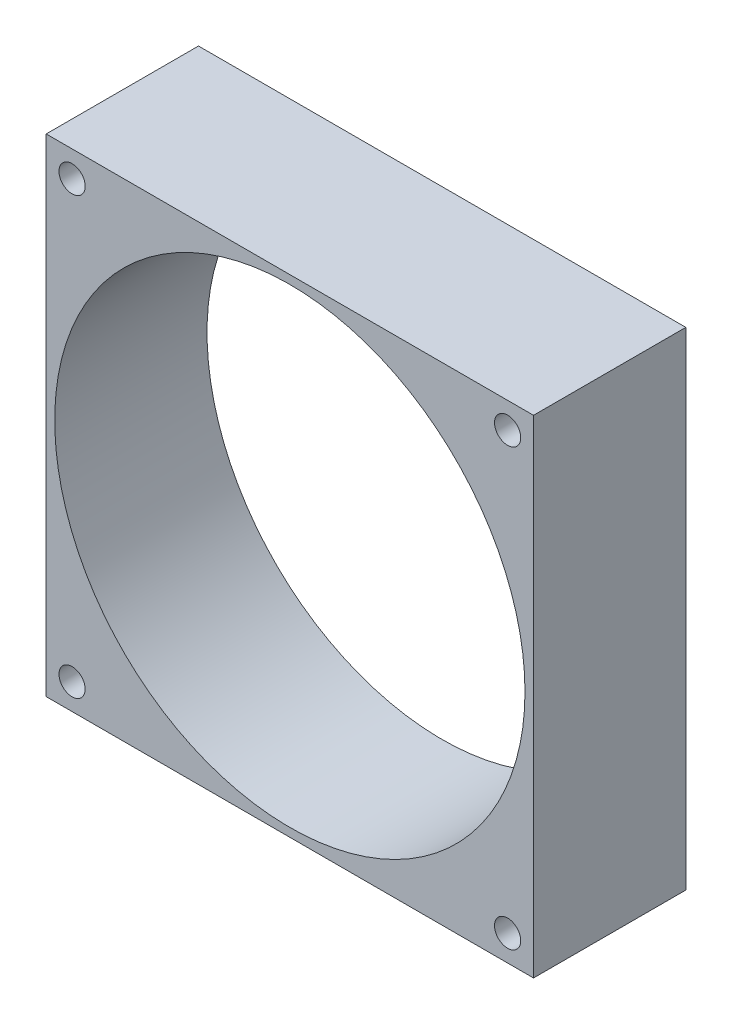
ISO-10303-21;
HEADER;
FILE_DESCRIPTION(('STEP AP214'),'2;1');
FILE_NAME('part.step','',(''),(''),'','','');
FILE_SCHEMA(('AUTOMOTIVE_DESIGN { 1 0 10303 214 1 1 1 1 }'));
ENDSEC;
DATA;
#1=APPLICATION_CONTEXT('core data for automotive mechanical design processes');
#2=APPLICATION_PROTOCOL_DEFINITION('international standard','automotive_design',2000,#1);
#3=PRODUCT_CONTEXT('',#1,'mechanical');
#4=PRODUCT('Part','Part','',(#3));
#5=PRODUCT_RELATED_PRODUCT_CATEGORY('part','',(#4));
#6=PRODUCT_DEFINITION_FORMATION('','',#4);
#7=PRODUCT_DEFINITION_CONTEXT('part definition',#1,'design');
#8=PRODUCT_DEFINITION('design','',#6,#7);
#9=PRODUCT_DEFINITION_SHAPE('','',#8);
#10=(LENGTH_UNIT() NAMED_UNIT(*) SI_UNIT(.MILLI.,.METRE.));
#11=(NAMED_UNIT(*) PLANE_ANGLE_UNIT() SI_UNIT($,.RADIAN.));
#12=(NAMED_UNIT(*) SI_UNIT($,.STERADIAN.) SOLID_ANGLE_UNIT());
#13=UNCERTAINTY_MEASURE_WITH_UNIT(LENGTH_MEASURE(1.E-05),#10,'distance_accuracy_value','');
#14=(GEOMETRIC_REPRESENTATION_CONTEXT(3) GLOBAL_UNCERTAINTY_ASSIGNED_CONTEXT((#13)) GLOBAL_UNIT_ASSIGNED_CONTEXT((#10,
#11,#12)) REPRESENTATION_CONTEXT('',''));
#15=CARTESIAN_POINT('',(0.,0.,0.));
#16=DIRECTION('',(0.,0.,1.));
#17=DIRECTION('',(1.,0.,0.));
#18=AXIS2_PLACEMENT_3D('',#15,#16,#17);
#19=CARTESIAN_POINT('',(0.,0.,25.));
#20=DIRECTION('',(0.,0.,-1.));
#21=DIRECTION('',(-1.,0.,0.));
#22=AXIS2_PLACEMENT_3D('',#19,#20,#21);
#23=PLANE('',#22);
#24=DIRECTION('',(0.,-1.,0.));
#25=VECTOR('',#24,1.);
#26=CARTESIAN_POINT('',(0.,0.,25.));
#27=LINE('',#26,#25);
#28=CARTESIAN_POINT('',(0.,80.,25.));
#29=VERTEX_POINT('',#28);
#30=CARTESIAN_POINT('',(0.,0.,25.));
#31=VERTEX_POINT('',#30);
#32=EDGE_CURVE('E85',#29,#31,#27,.T.);
#33=ORIENTED_EDGE('',*,*,#32,.T.);
#34=DIRECTION('',(1.,0.,0.));
#35=VECTOR('',#34,1.);
#36=CARTESIAN_POINT('',(0.,0.,25.));
#37=LINE('',#36,#35);
#38=CARTESIAN_POINT('',(80.,0.,25.));
#39=VERTEX_POINT('',#38);
#40=EDGE_CURVE('E80',#31,#39,#37,.T.);
#41=ORIENTED_EDGE('',*,*,#40,.T.);
#42=DIRECTION('',(0.,1.,0.));
#43=VECTOR('',#42,1.);
#44=CARTESIAN_POINT('',(80.,0.,25.));
#45=LINE('',#44,#43);
#46=CARTESIAN_POINT('',(80.,80.,25.));
#47=VERTEX_POINT('',#46);
#48=EDGE_CURVE('E83',#39,#47,#45,.T.);
#49=ORIENTED_EDGE('',*,*,#48,.T.);
#50=DIRECTION('',(-1.,0.,0.));
#51=VECTOR('',#50,1.);
#52=CARTESIAN_POINT('',(0.,80.,25.));
#53=LINE('',#52,#51);
#54=EDGE_CURVE('E50',#47,#29,#53,.T.);
#55=ORIENTED_EDGE('',*,*,#54,.T.);
#56=EDGE_LOOP('',(#33,#41,#49,#55));
#57=FACE_BOUND('',#56,.T.);
#58=CARTESIAN_POINT('',(40.,40.,25.));
#59=DIRECTION('',(0.,0.,1.));
#60=DIRECTION('',(1.,0.,0.));
#61=AXIS2_PLACEMENT_3D('',#58,#59,#60);
#62=CIRCLE('',#61,38.6);
#63=CARTESIAN_POINT('',(78.6,40.,25.));
#64=VERTEX_POINT('',#63);
#65=EDGE_CURVE('E100',#64,#64,#62,.T.);
#66=ORIENTED_EDGE('',*,*,#65,.F.);
#67=EDGE_LOOP('',(#66));
#68=FACE_BOUND('',#67,.T.);
#69=CARTESIAN_POINT('',(4.25000000000001,75.75,25.));
#70=DIRECTION('',(0.,0.,1.));
#71=DIRECTION('',(1.,0.,0.));
#72=AXIS2_PLACEMENT_3D('',#69,#70,#71);
#73=CIRCLE('',#72,2.15);
#74=CARTESIAN_POINT('',(6.40000000000001,75.75,25.));
#75=VERTEX_POINT('',#74);
#76=EDGE_CURVE('E115',#75,#75,#73,.T.);
#77=ORIENTED_EDGE('',*,*,#76,.F.);
#78=EDGE_LOOP('',(#77));
#79=FACE_BOUND('',#78,.T.);
#80=CARTESIAN_POINT('',(75.75,75.75,25.));
#81=DIRECTION('',(0.,0.,1.));
#82=DIRECTION('',(-1.,0.,0.));
#83=AXIS2_PLACEMENT_3D('',#80,#81,#82);
#84=CIRCLE('',#83,2.15);
#85=CARTESIAN_POINT('',(73.6,75.75,25.));
#86=VERTEX_POINT('',#85);
#87=EDGE_CURVE('E121',#86,#86,#84,.T.);
#88=ORIENTED_EDGE('',*,*,#87,.F.);
#89=EDGE_LOOP('',(#88));
#90=FACE_BOUND('',#89,.T.);
#91=CARTESIAN_POINT('',(4.25000000000001,4.25,25.));
#92=DIRECTION('',(0.,0.,1.));
#93=DIRECTION('',(-1.,0.,0.));
#94=AXIS2_PLACEMENT_3D('',#91,#92,#93);
#95=CIRCLE('',#94,2.15);
#96=CARTESIAN_POINT('',(2.10000000000001,4.25,25.));
#97=VERTEX_POINT('',#96);
#98=EDGE_CURVE('E127',#97,#97,#95,.T.);
#99=ORIENTED_EDGE('',*,*,#98,.F.);
#100=EDGE_LOOP('',(#99));
#101=FACE_BOUND('',#100,.T.);
#102=CARTESIAN_POINT('',(75.75,4.25,25.));
#103=DIRECTION('',(0.,0.,1.));
#104=DIRECTION('',(1.,0.,0.));
#105=AXIS2_PLACEMENT_3D('',#102,#103,#104);
#106=CIRCLE('',#105,2.15);
#107=CARTESIAN_POINT('',(77.9,4.25,25.));
#108=VERTEX_POINT('',#107);
#109=EDGE_CURVE('E133',#108,#108,#106,.T.);
#110=ORIENTED_EDGE('',*,*,#109,.F.);
#111=EDGE_LOOP('',(#110));
#112=FACE_BOUND('',#111,.T.);
#113=ADVANCED_FACE('F33',(#57,#68,#79,#90,#101,#112),#23,.F.);
#114=CARTESIAN_POINT('',(0.,0.,0.));
#115=DIRECTION('',(0.,0.,-1.));
#116=DIRECTION('',(-1.,0.,0.));
#117=AXIS2_PLACEMENT_3D('',#114,#115,#116);
#118=PLANE('',#117);
#119=CARTESIAN_POINT('',(4.25000000000001,4.25,0.));
#120=DIRECTION('',(0.,0.,1.));
#121=DIRECTION('',(-1.,0.,0.));
#122=AXIS2_PLACEMENT_3D('',#119,#120,#121);
#123=CIRCLE('',#122,2.15);
#124=CARTESIAN_POINT('',(2.10000000000001,4.25,0.));
#125=VERTEX_POINT('',#124);
#126=EDGE_CURVE('E130',#125,#125,#123,.T.);
#127=ORIENTED_EDGE('',*,*,#126,.T.);
#128=EDGE_LOOP('',(#127));
#129=FACE_BOUND('',#128,.T.);
#130=CARTESIAN_POINT('',(4.25000000000001,75.75,0.));
#131=DIRECTION('',(0.,0.,1.));
#132=DIRECTION('',(1.,0.,0.));
#133=AXIS2_PLACEMENT_3D('',#130,#131,#132);
#134=CIRCLE('',#133,2.15);
#135=CARTESIAN_POINT('',(6.40000000000001,75.75,0.));
#136=VERTEX_POINT('',#135);
#137=EDGE_CURVE('E118',#136,#136,#134,.T.);
#138=ORIENTED_EDGE('',*,*,#137,.T.);
#139=EDGE_LOOP('',(#138));
#140=FACE_BOUND('',#139,.T.);
#141=DIRECTION('',(0.,-1.,0.));
#142=VECTOR('',#141,1.);
#143=CARTESIAN_POINT('',(0.,0.,0.));
#144=LINE('',#143,#142);
#145=CARTESIAN_POINT('',(0.,80.,0.));
#146=VERTEX_POINT('',#145);
#147=CARTESIAN_POINT('',(0.,0.,0.));
#148=VERTEX_POINT('',#147);
#149=EDGE_CURVE('E97',#146,#148,#144,.T.);
#150=ORIENTED_EDGE('',*,*,#149,.F.);
#151=DIRECTION('',(-1.,0.,0.));
#152=VECTOR('',#151,1.);
#153=CARTESIAN_POINT('',(0.,80.,0.));
#154=LINE('',#153,#152);
#155=CARTESIAN_POINT('',(80.,80.,0.));
#156=VERTEX_POINT('',#155);
#157=EDGE_CURVE('E73',#156,#146,#154,.T.);
#158=ORIENTED_EDGE('',*,*,#157,.F.);
#159=DIRECTION('',(0.,1.,0.));
#160=VECTOR('',#159,1.);
#161=CARTESIAN_POINT('',(80.,0.,0.));
#162=LINE('',#161,#160);
#163=CARTESIAN_POINT('',(80.,0.,0.));
#164=VERTEX_POINT('',#163);
#165=EDGE_CURVE('E67',#164,#156,#162,.T.);
#166=ORIENTED_EDGE('',*,*,#165,.F.);
#167=DIRECTION('',(1.,0.,0.));
#168=VECTOR('',#167,1.);
#169=CARTESIAN_POINT('',(0.,0.,0.));
#170=LINE('',#169,#168);
#171=EDGE_CURVE('E89',#148,#164,#170,.T.);
#172=ORIENTED_EDGE('',*,*,#171,.F.);
#173=EDGE_LOOP('',(#150,#158,#166,#172));
#174=FACE_BOUND('',#173,.T.);
#175=CARTESIAN_POINT('',(40.,40.,0.));
#176=DIRECTION('',(0.,0.,1.));
#177=DIRECTION('',(1.,0.,0.));
#178=AXIS2_PLACEMENT_3D('',#175,#176,#177);
#179=CIRCLE('',#178,38.6);
#180=CARTESIAN_POINT('',(78.6,40.,0.));
#181=VERTEX_POINT('',#180);
#182=EDGE_CURVE('E112',#181,#181,#179,.T.);
#183=ORIENTED_EDGE('',*,*,#182,.T.);
#184=EDGE_LOOP('',(#183));
#185=FACE_BOUND('',#184,.T.);
#186=CARTESIAN_POINT('',(75.75,75.75,0.));
#187=DIRECTION('',(0.,0.,1.));
#188=DIRECTION('',(-1.,0.,0.));
#189=AXIS2_PLACEMENT_3D('',#186,#187,#188);
#190=CIRCLE('',#189,2.15);
#191=CARTESIAN_POINT('',(73.6,75.75,0.));
#192=VERTEX_POINT('',#191);
#193=EDGE_CURVE('E124',#192,#192,#190,.T.);
#194=ORIENTED_EDGE('',*,*,#193,.T.);
#195=EDGE_LOOP('',(#194));
#196=FACE_BOUND('',#195,.T.);
#197=CARTESIAN_POINT('',(75.75,4.25,0.));
#198=DIRECTION('',(0.,0.,1.));
#199=DIRECTION('',(1.,0.,0.));
#200=AXIS2_PLACEMENT_3D('',#197,#198,#199);
#201=CIRCLE('',#200,2.15);
#202=CARTESIAN_POINT('',(77.9,4.25,0.));
#203=VERTEX_POINT('',#202);
#204=EDGE_CURVE('E136',#203,#203,#201,.T.);
#205=ORIENTED_EDGE('',*,*,#204,.T.);
#206=EDGE_LOOP('',(#205));
#207=FACE_BOUND('',#206,.T.);
#208=ADVANCED_FACE('F108',(#129,#140,#174,#185,#196,#207),#118,.T.);
#209=CARTESIAN_POINT('',(0.,0.,25.));
#210=DIRECTION('',(1.,0.,0.));
#211=DIRECTION('',(0.,0.,-1.));
#212=AXIS2_PLACEMENT_3D('',#209,#210,#211);
#213=PLANE('',#212);
#214=ORIENTED_EDGE('',*,*,#149,.T.);
#215=DIRECTION('',(0.,0.,-1.));
#216=VECTOR('',#215,1.);
#217=CARTESIAN_POINT('',(0.,0.,25.));
#218=LINE('',#217,#216);
#219=EDGE_CURVE('E11',#31,#148,#218,.T.);
#220=ORIENTED_EDGE('',*,*,#219,.F.);
#221=ORIENTED_EDGE('',*,*,#32,.F.);
#222=DIRECTION('',(0.,0.,-1.));
#223=VECTOR('',#222,1.);
#224=CARTESIAN_POINT('',(0.,80.,25.));
#225=LINE('',#224,#223);
#226=EDGE_CURVE('E93',#29,#146,#225,.T.);
#227=ORIENTED_EDGE('',*,*,#226,.T.);
#228=EDGE_LOOP('',(#214,#220,#221,#227));
#229=FACE_BOUND('',#228,.T.);
#230=ADVANCED_FACE('F35',(#229),#213,.F.);
#231=CARTESIAN_POINT('',(0.,0.,25.));
#232=DIRECTION('',(0.,1.,0.));
#233=DIRECTION('',(0.,0.,1.));
#234=AXIS2_PLACEMENT_3D('',#231,#232,#233);
#235=PLANE('',#234);
#236=ORIENTED_EDGE('',*,*,#171,.T.);
#237=DIRECTION('',(0.,0.,-1.));
#238=VECTOR('',#237,1.);
#239=CARTESIAN_POINT('',(80.,0.,25.));
#240=LINE('',#239,#238);
#241=EDGE_CURVE('E42',#39,#164,#240,.T.);
#242=ORIENTED_EDGE('',*,*,#241,.F.);
#243=ORIENTED_EDGE('',*,*,#40,.F.);
#244=ORIENTED_EDGE('',*,*,#219,.T.);
#245=EDGE_LOOP('',(#236,#242,#243,#244));
#246=FACE_BOUND('',#245,.T.);
#247=ADVANCED_FACE('F88',(#246),#235,.F.);
#248=CARTESIAN_POINT('',(80.,0.,25.));
#249=DIRECTION('',(-1.,0.,0.));
#250=DIRECTION('',(0.,0.,1.));
#251=AXIS2_PLACEMENT_3D('',#248,#249,#250);
#252=PLANE('',#251);
#253=ORIENTED_EDGE('',*,*,#165,.T.);
#254=DIRECTION('',(0.,0.,-1.));
#255=VECTOR('',#254,1.);
#256=CARTESIAN_POINT('',(80.,80.,25.));
#257=LINE('',#256,#255);
#258=EDGE_CURVE('E90',#47,#156,#257,.T.);
#259=ORIENTED_EDGE('',*,*,#258,.F.);
#260=ORIENTED_EDGE('',*,*,#48,.F.);
#261=ORIENTED_EDGE('',*,*,#241,.T.);
#262=EDGE_LOOP('',(#253,#259,#260,#261));
#263=FACE_BOUND('',#262,.T.);
#264=ADVANCED_FACE('F91',(#263),#252,.F.);
#265=CARTESIAN_POINT('',(0.,80.,25.));
#266=DIRECTION('',(0.,-1.,0.));
#267=DIRECTION('',(0.,0.,-1.));
#268=AXIS2_PLACEMENT_3D('',#265,#266,#267);
#269=PLANE('',#268);
#270=ORIENTED_EDGE('',*,*,#157,.T.);
#271=ORIENTED_EDGE('',*,*,#226,.F.);
#272=ORIENTED_EDGE('',*,*,#54,.F.);
#273=ORIENTED_EDGE('',*,*,#258,.T.);
#274=EDGE_LOOP('',(#270,#271,#272,#273));
#275=FACE_BOUND('',#274,.T.);
#276=ADVANCED_FACE('F105',(#275),#269,.F.);
#277=CARTESIAN_POINT('',(40.,40.,25.));
#278=DIRECTION('',(0.,0.,-1.));
#279=DIRECTION('',(-1.,0.,0.));
#280=AXIS2_PLACEMENT_3D('',#277,#278,#279);
#281=CYLINDRICAL_SURFACE('',#280,38.6);
#282=ORIENTED_EDGE('',*,*,#65,.T.);
#283=EDGE_LOOP('',(#282));
#284=FACE_BOUND('',#283,.T.);
#285=ORIENTED_EDGE('',*,*,#182,.F.);
#286=EDGE_LOOP('',(#285));
#287=FACE_BOUND('',#286,.T.);
#288=ADVANCED_FACE('F153',(#284,#287),#281,.F.);
#289=CARTESIAN_POINT('',(4.25000000000001,75.75,25.));
#290=DIRECTION('',(0.,0.,-1.));
#291=DIRECTION('',(-1.,0.,0.));
#292=AXIS2_PLACEMENT_3D('',#289,#290,#291);
#293=CYLINDRICAL_SURFACE('',#292,2.15);
#294=ORIENTED_EDGE('',*,*,#76,.T.);
#295=EDGE_LOOP('',(#294));
#296=FACE_BOUND('',#295,.T.);
#297=ORIENTED_EDGE('',*,*,#137,.F.);
#298=EDGE_LOOP('',(#297));
#299=FACE_BOUND('',#298,.T.);
#300=ADVANCED_FACE('F199',(#296,#299),#293,.F.);
#301=CARTESIAN_POINT('',(75.75,75.75,25.));
#302=DIRECTION('',(0.,0.,-1.));
#303=DIRECTION('',(-1.,0.,0.));
#304=AXIS2_PLACEMENT_3D('',#301,#302,#303);
#305=CYLINDRICAL_SURFACE('',#304,2.15);
#306=ORIENTED_EDGE('',*,*,#87,.T.);
#307=EDGE_LOOP('',(#306));
#308=FACE_BOUND('',#307,.T.);
#309=ORIENTED_EDGE('',*,*,#193,.F.);
#310=EDGE_LOOP('',(#309));
#311=FACE_BOUND('',#310,.T.);
#312=ADVANCED_FACE('F207',(#308,#311),#305,.F.);
#313=CARTESIAN_POINT('',(4.25000000000001,4.25,25.));
#314=DIRECTION('',(0.,0.,-1.));
#315=DIRECTION('',(-1.,0.,0.));
#316=AXIS2_PLACEMENT_3D('',#313,#314,#315);
#317=CYLINDRICAL_SURFACE('',#316,2.15);
#318=ORIENTED_EDGE('',*,*,#98,.T.);
#319=EDGE_LOOP('',(#318));
#320=FACE_BOUND('',#319,.T.);
#321=ORIENTED_EDGE('',*,*,#126,.F.);
#322=EDGE_LOOP('',(#321));
#323=FACE_BOUND('',#322,.T.);
#324=ADVANCED_FACE('F215',(#320,#323),#317,.F.);
#325=CARTESIAN_POINT('',(75.75,4.25,25.));
#326=DIRECTION('',(0.,0.,-1.));
#327=DIRECTION('',(-1.,0.,0.));
#328=AXIS2_PLACEMENT_3D('',#325,#326,#327);
#329=CYLINDRICAL_SURFACE('',#328,2.15);
#330=ORIENTED_EDGE('',*,*,#109,.T.);
#331=EDGE_LOOP('',(#330));
#332=FACE_BOUND('',#331,.T.);
#333=ORIENTED_EDGE('',*,*,#204,.F.);
#334=EDGE_LOOP('',(#333));
#335=FACE_BOUND('',#334,.T.);
#336=ADVANCED_FACE('F142',(#332,#335),#329,.F.);
#337=CLOSED_SHELL('',(#113,#208,#230,#247,#264,#276,#288,#300,#312,#324,#336));
#338=MANIFOLD_SOLID_BREP('B2',#337);
#339=ADVANCED_BREP_SHAPE_REPRESENTATION('',(#18,#338),#14);
#340=SHAPE_DEFINITION_REPRESENTATION(#9,#339);
ENDSEC;
END-ISO-10303-21;
